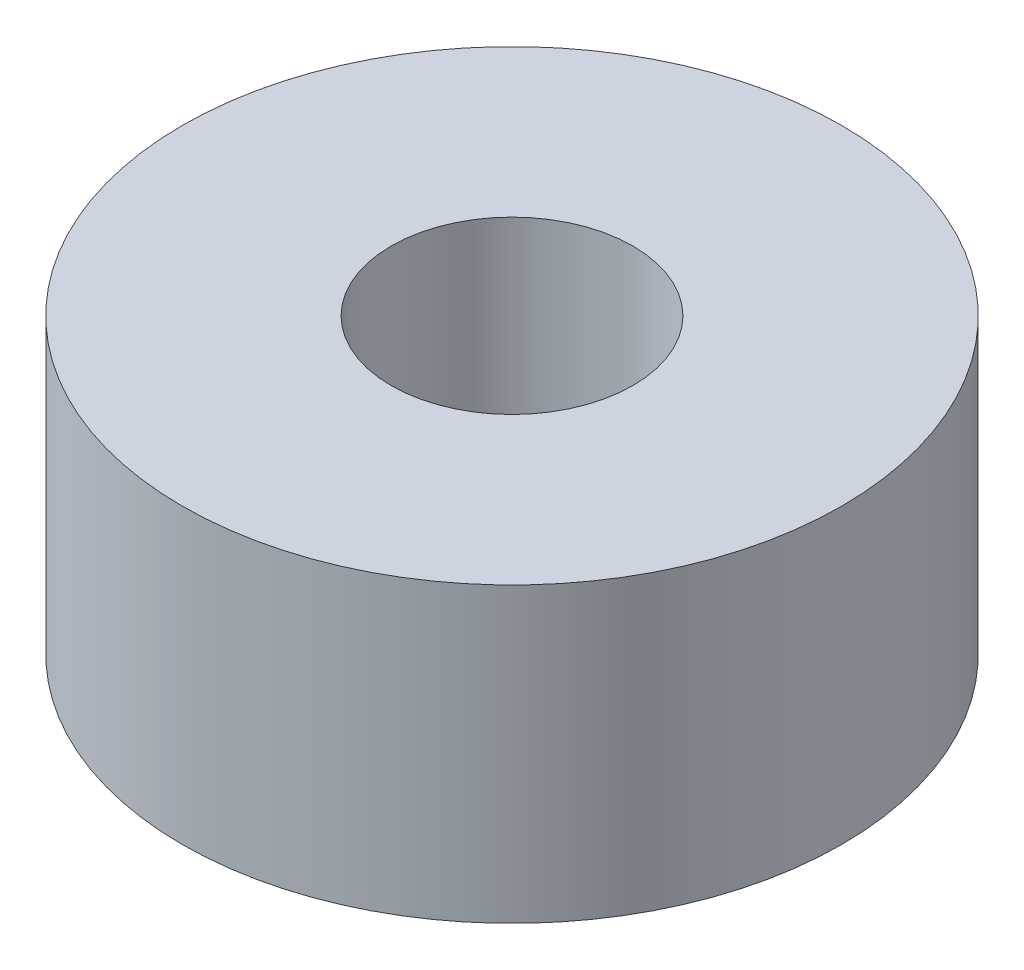
ISO-10303-21;
HEADER;
FILE_DESCRIPTION(('STEP AP214'),'2;1');
FILE_NAME('part.step','',(''),(''),'','','');
FILE_SCHEMA(('AUTOMOTIVE_DESIGN { 1 0 10303 214 1 1 1 1 }'));
ENDSEC;
DATA;
#1=APPLICATION_CONTEXT('core data for automotive mechanical design processes');
#2=APPLICATION_PROTOCOL_DEFINITION('international standard','automotive_design',2000,#1);
#3=PRODUCT_CONTEXT('',#1,'mechanical');
#4=PRODUCT('Part','Part','',(#3));
#5=PRODUCT_RELATED_PRODUCT_CATEGORY('part','',(#4));
#6=PRODUCT_DEFINITION_FORMATION('','',#4);
#7=PRODUCT_DEFINITION_CONTEXT('part definition',#1,'design');
#8=PRODUCT_DEFINITION('design','',#6,#7);
#9=PRODUCT_DEFINITION_SHAPE('','',#8);
#10=(LENGTH_UNIT() NAMED_UNIT(*) SI_UNIT(.MILLI.,.METRE.));
#11=(NAMED_UNIT(*) PLANE_ANGLE_UNIT() SI_UNIT($,.RADIAN.));
#12=(NAMED_UNIT(*) SI_UNIT($,.STERADIAN.) SOLID_ANGLE_UNIT());
#13=UNCERTAINTY_MEASURE_WITH_UNIT(LENGTH_MEASURE(1.E-05),#10,'distance_accuracy_value','');
#14=(GEOMETRIC_REPRESENTATION_CONTEXT(3) GLOBAL_UNCERTAINTY_ASSIGNED_CONTEXT((#13)) GLOBAL_UNIT_ASSIGNED_CONTEXT((#10,
#11,#12)) REPRESENTATION_CONTEXT('',''));
#15=CARTESIAN_POINT('',(0.,0.,0.));
#16=DIRECTION('',(0.,0.,1.));
#17=DIRECTION('',(1.,0.,0.));
#18=AXIS2_PLACEMENT_3D('',#15,#16,#17);
#19=CARTESIAN_POINT('',(0.,-1.,0.));
#20=DIRECTION('',(0.,1.,0.));
#21=DIRECTION('',(0.,0.,1.));
#22=AXIS2_PLACEMENT_3D('',#19,#20,#21);
#23=CYLINDRICAL_SURFACE('',#22,3.3);
#24=CARTESIAN_POINT('',(0.,0.,0.));
#25=DIRECTION('',(0.,1.,0.));
#26=DIRECTION('',(0.,0.,1.));
#27=AXIS2_PLACEMENT_3D('',#24,#25,#26);
#28=CIRCLE('',#27,3.3);
#29=CARTESIAN_POINT('',(0.,0.,3.3));
#30=VERTEX_POINT('',#29);
#31=EDGE_CURVE('E25',#30,#30,#28,.F.);
#32=ORIENTED_EDGE('',*,*,#31,.T.);
#33=EDGE_LOOP('',(#32));
#34=FACE_BOUND('',#33,.T.);
#35=CARTESIAN_POINT('',(0.,8.,0.));
#36=DIRECTION('',(0.,1.,0.));
#37=DIRECTION('',(0.,0.,1.));
#38=AXIS2_PLACEMENT_3D('',#35,#36,#37);
#39=CIRCLE('',#38,3.3);
#40=CARTESIAN_POINT('',(0.,8.,3.3));
#41=VERTEX_POINT('',#40);
#42=EDGE_CURVE('E16',#41,#41,#39,.F.);
#43=ORIENTED_EDGE('',*,*,#42,.F.);
#44=EDGE_LOOP('',(#43));
#45=FACE_BOUND('',#44,.T.);
#46=ADVANCED_FACE('F13',(#34,#45),#23,.F.);
#47=CARTESIAN_POINT('',(0.,8.,0.));
#48=DIRECTION('',(0.,1.,0.));
#49=DIRECTION('',(0.,0.,1.));
#50=AXIS2_PLACEMENT_3D('',#47,#48,#49);
#51=PLANE('',#50);
#52=ORIENTED_EDGE('',*,*,#42,.T.);
#53=EDGE_LOOP('',(#52));
#54=FACE_BOUND('',#53,.T.);
#55=CARTESIAN_POINT('',(0.,8.,0.));
#56=DIRECTION('',(0.,1.,0.));
#57=DIRECTION('',(0.,0.,1.));
#58=AXIS2_PLACEMENT_3D('',#55,#56,#57);
#59=CIRCLE('',#58,9.);
#60=CARTESIAN_POINT('',(0.,8.,9.));
#61=VERTEX_POINT('',#60);
#62=EDGE_CURVE('E20',#61,#61,#59,.F.);
#63=ORIENTED_EDGE('',*,*,#62,.F.);
#64=EDGE_LOOP('',(#63));
#65=FACE_BOUND('',#64,.T.);
#66=ADVANCED_FACE('F33',(#54,#65),#51,.T.);
#67=CARTESIAN_POINT('',(0.,0.,0.));
#68=DIRECTION('',(0.,1.,0.));
#69=DIRECTION('',(0.,0.,1.));
#70=AXIS2_PLACEMENT_3D('',#67,#68,#69);
#71=PLANE('',#70);
#72=ORIENTED_EDGE('',*,*,#31,.F.);
#73=EDGE_LOOP('',(#72));
#74=FACE_BOUND('',#73,.T.);
#75=CARTESIAN_POINT('',(0.,0.,0.));
#76=DIRECTION('',(0.,1.,0.));
#77=DIRECTION('',(0.,0.,1.));
#78=AXIS2_PLACEMENT_3D('',#75,#76,#77);
#79=CIRCLE('',#78,9.);
#80=CARTESIAN_POINT('',(0.,0.,9.));
#81=VERTEX_POINT('',#80);
#82=EDGE_CURVE('E8',#81,#81,#79,.T.);
#83=ORIENTED_EDGE('',*,*,#82,.F.);
#84=EDGE_LOOP('',(#83));
#85=FACE_BOUND('',#84,.T.);
#86=ADVANCED_FACE('F41',(#74,#85),#71,.F.);
#87=CARTESIAN_POINT('',(0.,0.,0.));
#88=DIRECTION('',(0.,1.,0.));
#89=DIRECTION('',(0.,0.,1.));
#90=AXIS2_PLACEMENT_3D('',#87,#88,#89);
#91=CYLINDRICAL_SURFACE('',#90,9.);
#92=ORIENTED_EDGE('',*,*,#82,.T.);
#93=EDGE_LOOP('',(#92));
#94=FACE_BOUND('',#93,.T.);
#95=ORIENTED_EDGE('',*,*,#62,.T.);
#96=EDGE_LOOP('',(#95));
#97=FACE_BOUND('',#96,.T.);
#98=ADVANCED_FACE('F42',(#94,#97),#91,.T.);
#99=CLOSED_SHELL('',(#46,#66,#86,#98));
#100=MANIFOLD_SOLID_BREP('B1',#99);
#101=ADVANCED_BREP_SHAPE_REPRESENTATION('',(#18,#100),#14);
#102=SHAPE_DEFINITION_REPRESENTATION(#9,#101);
ENDSEC;
END-ISO-10303-21;
